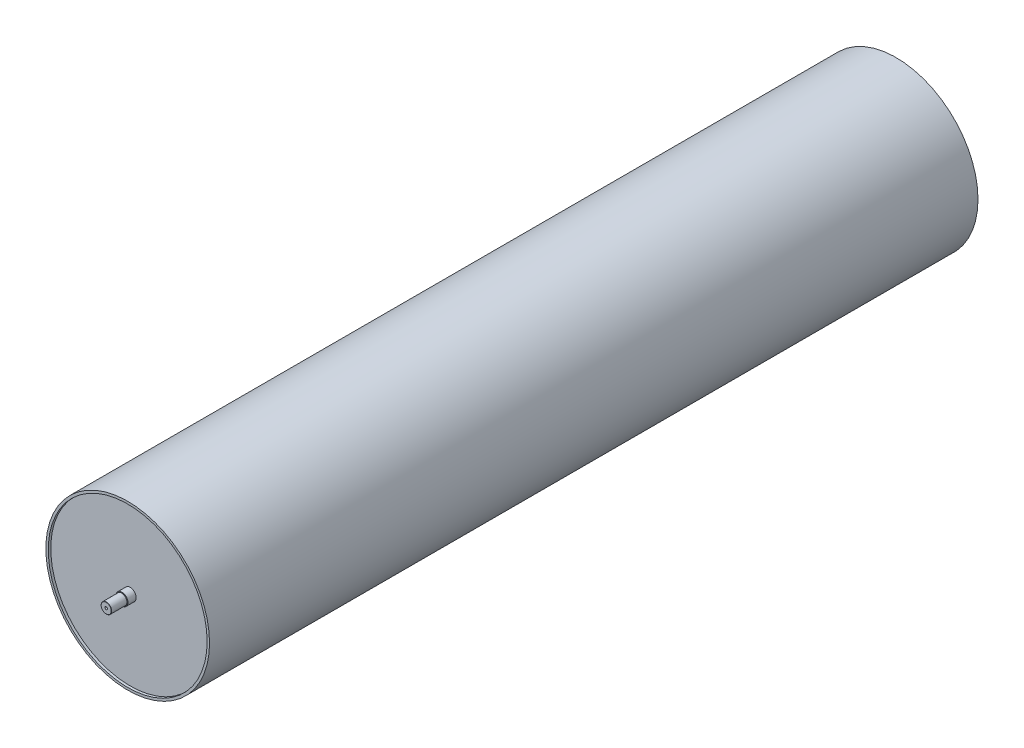
ISO-10303-21;
HEADER;
FILE_DESCRIPTION(('STEP AP214'),'2;1');
FILE_NAME('part.step','',(''),(''),'','','');
FILE_SCHEMA(('AUTOMOTIVE_DESIGN { 1 0 10303 214 1 1 1 1 }'));
ENDSEC;
DATA;
#1=APPLICATION_CONTEXT('core data for automotive mechanical design processes');
#2=APPLICATION_PROTOCOL_DEFINITION('international standard','automotive_design',2000,#1);
#3=PRODUCT_CONTEXT('',#1,'mechanical');
#4=PRODUCT('Part','Part','',(#3));
#5=PRODUCT_RELATED_PRODUCT_CATEGORY('part','',(#4));
#6=PRODUCT_DEFINITION_FORMATION('','',#4);
#7=PRODUCT_DEFINITION_CONTEXT('part definition',#1,'design');
#8=PRODUCT_DEFINITION('design','',#6,#7);
#9=PRODUCT_DEFINITION_SHAPE('','',#8);
#10=(LENGTH_UNIT() NAMED_UNIT(*) SI_UNIT(.MILLI.,.METRE.));
#11=(NAMED_UNIT(*) PLANE_ANGLE_UNIT() SI_UNIT($,.RADIAN.));
#12=(NAMED_UNIT(*) SI_UNIT($,.STERADIAN.) SOLID_ANGLE_UNIT());
#13=UNCERTAINTY_MEASURE_WITH_UNIT(LENGTH_MEASURE(1.E-05),#10,'distance_accuracy_value','');
#14=(GEOMETRIC_REPRESENTATION_CONTEXT(3) GLOBAL_UNCERTAINTY_ASSIGNED_CONTEXT((#13)) GLOBAL_UNIT_ASSIGNED_CONTEXT((#10,
#11,#12)) REPRESENTATION_CONTEXT('',''));
#15=CARTESIAN_POINT('',(0.,0.,0.));
#16=DIRECTION('',(0.,0.,1.));
#17=DIRECTION('',(1.,0.,0.));
#18=AXIS2_PLACEMENT_3D('',#15,#16,#17);
#19=CARTESIAN_POINT('',(0.,0.,767.5));
#20=DIRECTION('',(0.,0.,-1.));
#21=DIRECTION('',(-1.,0.,0.));
#22=AXIS2_PLACEMENT_3D('',#19,#20,#21);
#23=CYLINDRICAL_SURFACE('',#22,158.7);
#24=CARTESIAN_POINT('',(0.,0.,-762.5));
#25=DIRECTION('',(0.,0.,-1.));
#26=DIRECTION('',(-1.,0.,0.));
#27=AXIS2_PLACEMENT_3D('',#24,#25,#26);
#28=CIRCLE('',#27,158.7);
#29=CARTESIAN_POINT('',(-158.7,0.,-762.5));
#30=VERTEX_POINT('',#29);
#31=EDGE_CURVE('E125',#30,#30,#28,.T.);
#32=ORIENTED_EDGE('',*,*,#31,.F.);
#33=EDGE_LOOP('',(#32));
#34=FACE_BOUND('',#33,.T.);
#35=CARTESIAN_POINT('',(0.,0.,-767.5));
#36=DIRECTION('',(0.,0.,1.));
#37=DIRECTION('',(1.,0.,0.));
#38=AXIS2_PLACEMENT_3D('',#35,#36,#37);
#39=CIRCLE('',#38,158.7);
#40=CARTESIAN_POINT('',(158.7,0.,-767.5));
#41=VERTEX_POINT('',#40);
#42=EDGE_CURVE('E83',#41,#41,#39,.T.);
#43=ORIENTED_EDGE('',*,*,#42,.F.);
#44=EDGE_LOOP('',(#43));
#45=FACE_BOUND('',#44,.T.);
#46=ADVANCED_FACE('F39',(#34,#45),#23,.F.);
#47=CARTESIAN_POINT('',(0.,0.,767.5));
#48=DIRECTION('',(0.,0.,1.));
#49=DIRECTION('',(1.,0.,0.));
#50=AXIS2_PLACEMENT_3D('',#47,#48,#49);
#51=PLANE('',#50);
#52=CARTESIAN_POINT('',(0.,0.,767.5));
#53=DIRECTION('',(0.,0.,1.));
#54=DIRECTION('',(1.,0.,0.));
#55=AXIS2_PLACEMENT_3D('',#52,#53,#54);
#56=CIRCLE('',#55,163.5);
#57=CARTESIAN_POINT('',(163.5,0.,767.5));
#58=VERTEX_POINT('',#57);
#59=EDGE_CURVE('E90',#58,#58,#56,.T.);
#60=ORIENTED_EDGE('',*,*,#59,.T.);
#61=EDGE_LOOP('',(#60));
#62=FACE_BOUND('',#61,.T.);
#63=CARTESIAN_POINT('',(0.,0.,767.5));
#64=DIRECTION('',(0.,0.,1.));
#65=DIRECTION('',(1.,0.,0.));
#66=AXIS2_PLACEMENT_3D('',#63,#64,#65);
#67=CIRCLE('',#66,158.7);
#68=CARTESIAN_POINT('',(158.7,0.,767.5));
#69=VERTEX_POINT('',#68);
#70=EDGE_CURVE('E84',#69,#69,#67,.T.);
#71=ORIENTED_EDGE('',*,*,#70,.F.);
#72=EDGE_LOOP('',(#71));
#73=FACE_BOUND('',#72,.T.);
#74=ADVANCED_FACE('F161',(#62,#73),#51,.T.);
#75=CARTESIAN_POINT('',(0.,0.,-767.5));
#76=DIRECTION('',(0.,0.,1.));
#77=DIRECTION('',(1.,0.,0.));
#78=AXIS2_PLACEMENT_3D('',#75,#76,#77);
#79=PLANE('',#78);
#80=CARTESIAN_POINT('',(0.,0.,-767.5));
#81=DIRECTION('',(0.,0.,1.));
#82=DIRECTION('',(1.,0.,0.));
#83=AXIS2_PLACEMENT_3D('',#80,#81,#82);
#84=CIRCLE('',#83,163.5);
#85=CARTESIAN_POINT('',(163.5,0.,-767.5));
#86=VERTEX_POINT('',#85);
#87=EDGE_CURVE('E87',#86,#86,#84,.T.);
#88=ORIENTED_EDGE('',*,*,#87,.F.);
#89=EDGE_LOOP('',(#88));
#90=FACE_BOUND('',#89,.T.);
#91=ORIENTED_EDGE('',*,*,#42,.T.);
#92=EDGE_LOOP('',(#91));
#93=FACE_BOUND('',#92,.T.);
#94=ADVANCED_FACE('F174',(#90,#93),#79,.F.);
#95=CARTESIAN_POINT('',(0.,0.,767.5));
#96=DIRECTION('',(0.,0.,-1.));
#97=DIRECTION('',(-1.,0.,0.));
#98=AXIS2_PLACEMENT_3D('',#95,#96,#97);
#99=CYLINDRICAL_SURFACE('',#98,163.5);
#100=ORIENTED_EDGE('',*,*,#59,.F.);
#101=EDGE_LOOP('',(#100));
#102=FACE_BOUND('',#101,.T.);
#103=ORIENTED_EDGE('',*,*,#87,.T.);
#104=EDGE_LOOP('',(#103));
#105=FACE_BOUND('',#104,.T.);
#106=ADVANCED_FACE('F165',(#102,#105),#99,.T.);
#107=CARTESIAN_POINT('',(0.,0.,762.5));
#108=DIRECTION('',(0.,0.,1.));
#109=DIRECTION('',(1.,0.,0.));
#110=AXIS2_PLACEMENT_3D('',#107,#108,#109);
#111=CIRCLE('',#110,158.7);
#112=CARTESIAN_POINT('',(158.7,0.,762.5));
#113=VERTEX_POINT('',#112);
#114=EDGE_CURVE('E79',#113,#113,#111,.T.);
#115=ORIENTED_EDGE('',*,*,#114,.F.);
#116=EDGE_LOOP('',(#115));
#117=FACE_BOUND('',#116,.T.);
#118=ORIENTED_EDGE('',*,*,#70,.T.);
#119=EDGE_LOOP('',(#118));
#120=FACE_BOUND('',#119,.T.);
#121=ADVANCED_FACE('F148',(#117,#120),#23,.F.);
#122=CARTESIAN_POINT('',(0.,0.,762.5));
#123=DIRECTION('',(0.,0.,1.));
#124=DIRECTION('',(1.,0.,0.));
#125=AXIS2_PLACEMENT_3D('',#122,#123,#124);
#126=PLANE('',#125);
#127=CARTESIAN_POINT('',(0.,-3.06087000983314E-11,762.5));
#128=DIRECTION('',(0.,0.,1.));
#129=DIRECTION('',(1.,0.,0.));
#130=AXIS2_PLACEMENT_3D('',#127,#128,#129);
#131=CIRCLE('',#130,12.0000000000159);
#132=CARTESIAN_POINT('',(12.0000000000159,-3.06087000983314E-11,762.5));
#133=VERTEX_POINT('',#132);
#134=EDGE_CURVE('E74',#133,#133,#131,.F.);
#135=ORIENTED_EDGE('',*,*,#134,.T.);
#136=EDGE_LOOP('',(#135));
#137=FACE_BOUND('',#136,.T.);
#138=ORIENTED_EDGE('',*,*,#114,.T.);
#139=EDGE_LOOP('',(#138));
#140=FACE_BOUND('',#139,.T.);
#141=ADVANCED_FACE('F164',(#137,#140),#126,.T.);
#142=CARTESIAN_POINT('',(0.,-2.02962646689284E-13,810.5));
#143=DIRECTION('',(0.,0.,-1.));
#144=DIRECTION('',(0.,1.,0.));
#145=AXIS2_PLACEMENT_3D('',#142,#143,#144);
#146=PLANE('',#145);
#147=CARTESIAN_POINT('',(0.,-1.7245381709964E-11,810.5));
#148=DIRECTION('',(0.,0.,1.));
#149=DIRECTION('',(1.,0.,0.));
#150=AXIS2_PLACEMENT_3D('',#147,#148,#149);
#151=CIRCLE('',#150,2.49999999999999);
#152=CARTESIAN_POINT('',(2.49999999999999,-1.7245381709964E-11,810.5));
#153=VERTEX_POINT('',#152);
#154=EDGE_CURVE('E62',#153,#153,#151,.T.);
#155=ORIENTED_EDGE('',*,*,#154,.F.);
#156=EDGE_LOOP('',(#155));
#157=FACE_BOUND('',#156,.T.);
#158=CARTESIAN_POINT('',(0.,-3.15365293403396E-11,810.5));
#159=DIRECTION('',(0.,0.,-1.));
#160=DIRECTION('',(0.,1.,0.));
#161=AXIS2_PLACEMENT_3D('',#158,#159,#160);
#162=CIRCLE('',#161,10.0000000000314);
#163=CARTESIAN_POINT('',(0.,9.99999999999984,810.5));
#164=VERTEX_POINT('',#163);
#165=EDGE_CURVE('E104',#164,#164,#162,.F.);
#166=ORIENTED_EDGE('',*,*,#165,.T.);
#167=EDGE_LOOP('',(#166));
#168=FACE_BOUND('',#167,.T.);
#169=ADVANCED_FACE('F171',(#157,#168),#146,.F.);
#170=CARTESIAN_POINT('',(0.,-2.02962646689286E-13,-810.5));
#171=DIRECTION('',(0.,0.,1.));
#172=DIRECTION('',(0.,-1.,0.));
#173=AXIS2_PLACEMENT_3D('',#170,#171,#172);
#174=CYLINDRICAL_SURFACE('',#173,10.5000000000312);
#175=CARTESIAN_POINT('',(0.,-3.1526864452402E-11,810.));
#176=DIRECTION('',(0.,0.,-1.));
#177=DIRECTION('',(0.,1.,0.));
#178=AXIS2_PLACEMENT_3D('',#175,#176,#177);
#179=CIRCLE('',#178,10.5000000000312);
#180=CARTESIAN_POINT('',(0.,10.4999999999997,810.));
#181=VERTEX_POINT('',#180);
#182=EDGE_CURVE('E107',#181,#181,#179,.T.);
#183=ORIENTED_EDGE('',*,*,#182,.T.);
#184=EDGE_LOOP('',(#183));
#185=FACE_BOUND('',#184,.T.);
#186=CARTESIAN_POINT('',(0.,-3.09373062882093E-11,779.5));
#187=DIRECTION('',(0.,0.,1.));
#188=DIRECTION('',(0.,-1.,0.));
#189=AXIS2_PLACEMENT_3D('',#186,#187,#188);
#190=CIRCLE('',#189,10.5000000000309);
#191=CARTESIAN_POINT('',(0.,-10.5000000000619,779.499999999999));
#192=VERTEX_POINT('',#191);
#193=EDGE_CURVE('E61',#192,#192,#190,.T.);
#194=ORIENTED_EDGE('',*,*,#193,.T.);
#195=EDGE_LOOP('',(#194));
#196=FACE_BOUND('',#195,.T.);
#197=ADVANCED_FACE('F247',(#185,#196),#174,.T.);
#198=CARTESIAN_POINT('',(0.,10.5,779.5));
#199=DIRECTION('',(0.,0.,-1.));
#200=DIRECTION('',(0.,1.,0.));
#201=AXIS2_PLACEMENT_3D('',#198,#199,#200);
#202=PLANE('',#201);
#203=CARTESIAN_POINT('',(0.,-3.09373062882093E-11,779.5));
#204=DIRECTION('',(0.,0.,-1.));
#205=DIRECTION('',(0.,1.,0.));
#206=AXIS2_PLACEMENT_3D('',#203,#204,#205);
#207=CIRCLE('',#206,11.5000000000308);
#208=CARTESIAN_POINT('',(0.,11.4999999999998,779.5));
#209=VERTEX_POINT('',#208);
#210=EDGE_CURVE('E110',#209,#209,#207,.F.);
#211=ORIENTED_EDGE('',*,*,#210,.T.);
#212=EDGE_LOOP('',(#211));
#213=FACE_BOUND('',#212,.T.);
#214=ORIENTED_EDGE('',*,*,#193,.F.);
#215=EDGE_LOOP('',(#214));
#216=FACE_BOUND('',#215,.T.);
#217=ADVANCED_FACE('F244',(#213,#216),#202,.F.);
#218=CARTESIAN_POINT('',(0.,-2.02962646689286E-13,-810.5));
#219=DIRECTION('',(0.,0.,1.));
#220=DIRECTION('',(0.,-1.,0.));
#221=AXIS2_PLACEMENT_3D('',#218,#219,#220);
#222=CYLINDRICAL_SURFACE('',#221,12.0000000000159);
#223=CARTESIAN_POINT('',(0.,-3.0927641400272E-11,779.000000000015));
#224=DIRECTION('',(0.,0.,-1.));
#225=DIRECTION('',(0.,1.,0.));
#226=AXIS2_PLACEMENT_3D('',#223,#224,#225);
#227=CIRCLE('',#226,12.0000000000159);
#228=CARTESIAN_POINT('',(0.,11.9999999999849,779.000000000015));
#229=VERTEX_POINT('',#228);
#230=EDGE_CURVE('E113',#229,#229,#227,.T.);
#231=ORIENTED_EDGE('',*,*,#230,.T.);
#232=EDGE_LOOP('',(#231));
#233=FACE_BOUND('',#232,.T.);
#234=ORIENTED_EDGE('',*,*,#134,.F.);
#235=EDGE_LOOP('',(#234));
#236=FACE_BOUND('',#235,.T.);
#237=ADVANCED_FACE('F205',(#233,#236),#222,.T.);
#238=CARTESIAN_POINT('',(0.,-3.15365293403396E-11,810.5));
#239=DIRECTION('',(0.,0.,-1.));
#240=DIRECTION('',(0.,1.,0.));
#241=AXIS2_PLACEMENT_3D('',#238,#239,#240);
#242=CONICAL_SURFACE('',#241,10.0000000000313,0.785398163397693);
#243=ORIENTED_EDGE('',*,*,#182,.F.);
#244=EDGE_LOOP('',(#243));
#245=FACE_BOUND('',#244,.T.);
#246=ORIENTED_EDGE('',*,*,#165,.F.);
#247=EDGE_LOOP('',(#246));
#248=FACE_BOUND('',#247,.T.);
#249=ADVANCED_FACE('F199',(#245,#248),#242,.T.);
#250=CARTESIAN_POINT('',(0.,-3.09373062882093E-11,779.5));
#251=DIRECTION('',(0.,0.,-1.));
#252=DIRECTION('',(0.,1.,0.));
#253=AXIS2_PLACEMENT_3D('',#250,#251,#252);
#254=CONICAL_SURFACE('',#253,11.5000000000308,0.78539816339746);
#255=ORIENTED_EDGE('',*,*,#230,.F.);
#256=EDGE_LOOP('',(#255));
#257=FACE_BOUND('',#256,.T.);
#258=ORIENTED_EDGE('',*,*,#210,.F.);
#259=EDGE_LOOP('',(#258));
#260=FACE_BOUND('',#259,.T.);
#261=ADVANCED_FACE('F55',(#257,#260),#254,.T.);
#262=CARTESIAN_POINT('',(0.,-1.7245381709964E-11,795.5));
#263=DIRECTION('',(0.,0.,1.));
#264=DIRECTION('',(1.,0.,0.));
#265=AXIS2_PLACEMENT_3D('',#262,#263,#264);
#266=CONICAL_SURFACE('',#265,2.49999999999999,1.02974425867667);
#267=CARTESIAN_POINT('',(0.,-1.7245381709964E-11,793.997848452431));
#268=VERTEX_POINT('',#267);
#269=VERTEX_LOOP('',#268);
#270=FACE_BOUND('',#269,.T.);
#271=CARTESIAN_POINT('',(0.,-1.7245381709964E-11,795.5));
#272=DIRECTION('',(0.,0.,1.));
#273=DIRECTION('',(1.,0.,0.));
#274=AXIS2_PLACEMENT_3D('',#271,#272,#273);
#275=CIRCLE('',#274,2.49999999999999);
#276=CARTESIAN_POINT('',(2.49999999999999,-1.7245381709964E-11,795.5));
#277=VERTEX_POINT('',#276);
#278=EDGE_CURVE('E59',#277,#277,#275,.T.);
#279=ORIENTED_EDGE('',*,*,#278,.T.);
#280=EDGE_LOOP('',(#279));
#281=FACE_BOUND('',#280,.T.);
#282=ADVANCED_FACE('F51',(#270,#281),#266,.F.);
#283=CARTESIAN_POINT('',(0.,-1.7245381709964E-11,810.5));
#284=DIRECTION('',(0.,0.,1.));
#285=DIRECTION('',(1.,0.,0.));
#286=AXIS2_PLACEMENT_3D('',#283,#284,#285);
#287=CYLINDRICAL_SURFACE('',#286,2.49999999999999);
#288=ORIENTED_EDGE('',*,*,#278,.F.);
#289=EDGE_LOOP('',(#288));
#290=FACE_BOUND('',#289,.T.);
#291=ORIENTED_EDGE('',*,*,#154,.T.);
#292=EDGE_LOOP('',(#291));
#293=FACE_BOUND('',#292,.T.);
#294=ADVANCED_FACE('F54',(#290,#293),#287,.F.);
#295=CARTESIAN_POINT('',(0.,0.,-762.5));
#296=DIRECTION('',(0.,0.,-1.));
#297=DIRECTION('',(1.,0.,0.));
#298=AXIS2_PLACEMENT_3D('',#295,#296,#297);
#299=PLANE('',#298);
#300=CARTESIAN_POINT('',(0.,-1.13079188869744E-12,-762.5));
#301=DIRECTION('',(0.,0.,-1.));
#302=DIRECTION('',(-1.,0.,0.));
#303=AXIS2_PLACEMENT_3D('',#300,#301,#302);
#304=CIRCLE('',#303,12.0000000000159);
#305=CARTESIAN_POINT('',(-12.0000000000159,-1.13079188869744E-12,-762.5));
#306=VERTEX_POINT('',#305);
#307=EDGE_CURVE('E68',#306,#306,#304,.T.);
#308=ORIENTED_EDGE('',*,*,#307,.F.);
#309=EDGE_LOOP('',(#308));
#310=FACE_BOUND('',#309,.T.);
#311=ORIENTED_EDGE('',*,*,#31,.T.);
#312=EDGE_LOOP('',(#311));
#313=FACE_BOUND('',#312,.T.);
#314=ADVANCED_FACE('F265',(#310,#313),#299,.T.);
#315=CARTESIAN_POINT('',(0.,10.5,-810.5));
#316=DIRECTION('',(0.,0.,1.));
#317=DIRECTION('',(0.,-1.,0.));
#318=AXIS2_PLACEMENT_3D('',#315,#316,#317);
#319=PLANE('',#318);
#320=CARTESIAN_POINT('',(0.,-2.09056045117504E-13,-810.5));
#321=DIRECTION('',(0.,0.,-1.));
#322=DIRECTION('',(0.,1.,0.));
#323=AXIS2_PLACEMENT_3D('',#320,#321,#322);
#324=CIRCLE('',#323,7.00000000000412);
#325=CARTESIAN_POINT('',(0.,7.00000000000391,-810.5));
#326=VERTEX_POINT('',#325);
#327=EDGE_CURVE('E130',#326,#326,#324,.T.);
#328=ORIENTED_EDGE('',*,*,#327,.F.);
#329=EDGE_LOOP('',(#328));
#330=FACE_BOUND('',#329,.T.);
#331=CARTESIAN_POINT('',(0.,-2.02962646689284E-13,-810.5));
#332=DIRECTION('',(0.,0.,1.));
#333=DIRECTION('',(0.,-1.,0.));
#334=AXIS2_PLACEMENT_3D('',#331,#332,#333);
#335=CIRCLE('',#334,10.0000000000004);
#336=CARTESIAN_POINT('',(0.,-10.0000000000006,-810.5));
#337=VERTEX_POINT('',#336);
#338=EDGE_CURVE('E101',#337,#337,#335,.F.);
#339=ORIENTED_EDGE('',*,*,#338,.T.);
#340=EDGE_LOOP('',(#339));
#341=FACE_BOUND('',#340,.T.);
#342=ADVANCED_FACE('F197',(#330,#341),#319,.F.);
#343=CARTESIAN_POINT('',(0.,-2.12627534626871E-13,-810.));
#344=DIRECTION('',(0.,0.,1.));
#345=DIRECTION('',(0.,-1.,0.));
#346=AXIS2_PLACEMENT_3D('',#343,#344,#345);
#347=CONICAL_SURFACE('',#346,10.5000000000005,0.785398163397469);
#348=ORIENTED_EDGE('',*,*,#338,.F.);
#349=EDGE_LOOP('',(#348));
#350=FACE_BOUND('',#349,.T.);
#351=CARTESIAN_POINT('',(0.,-2.1262753462687E-13,-810.));
#352=DIRECTION('',(0.,0.,1.));
#353=DIRECTION('',(0.,-1.,0.));
#354=AXIS2_PLACEMENT_3D('',#351,#352,#353);
#355=CIRCLE('',#354,10.5000000000005);
#356=CARTESIAN_POINT('',(0.,-10.5000000000007,-810.));
#357=VERTEX_POINT('',#356);
#358=EDGE_CURVE('E78',#357,#357,#355,.T.);
#359=ORIENTED_EDGE('',*,*,#358,.F.);
#360=EDGE_LOOP('',(#359));
#361=FACE_BOUND('',#360,.T.);
#362=ADVANCED_FACE('F190',(#350,#361),#347,.T.);
#363=CARTESIAN_POINT('',(0.,-2.02962646689286E-13,-810.5));
#364=DIRECTION('',(0.,0.,1.));
#365=DIRECTION('',(0.,-1.,0.));
#366=AXIS2_PLACEMENT_3D('',#363,#364,#365);
#367=CYLINDRICAL_SURFACE('',#366,10.5000000000005);
#368=ORIENTED_EDGE('',*,*,#358,.T.);
#369=EDGE_LOOP('',(#368));
#370=FACE_BOUND('',#369,.T.);
#371=CARTESIAN_POINT('',(0.,-8.02185698819547E-13,-779.5));
#372=DIRECTION('',(0.,0.,1.));
#373=DIRECTION('',(0.,-1.,0.));
#374=AXIS2_PLACEMENT_3D('',#371,#372,#373);
#375=CIRCLE('',#374,10.5000000000008);
#376=CARTESIAN_POINT('',(0.,-10.5000000000016,-779.5));
#377=VERTEX_POINT('',#376);
#378=EDGE_CURVE('E65',#377,#377,#375,.T.);
#379=ORIENTED_EDGE('',*,*,#378,.F.);
#380=EDGE_LOOP('',(#379));
#381=FACE_BOUND('',#380,.T.);
#382=ADVANCED_FACE('F196',(#370,#381),#367,.T.);
#383=CARTESIAN_POINT('',(0.,12.,-779.5));
#384=DIRECTION('',(0.,0.,1.));
#385=DIRECTION('',(0.,-1.,0.));
#386=AXIS2_PLACEMENT_3D('',#383,#384,#385);
#387=PLANE('',#386);
#388=CARTESIAN_POINT('',(0.,-8.02185698819545E-13,-779.5));
#389=DIRECTION('',(0.,0.,1.));
#390=DIRECTION('',(0.,-1.,0.));
#391=AXIS2_PLACEMENT_3D('',#388,#389,#390);
#392=CIRCLE('',#391,11.500000000001);
#393=CARTESIAN_POINT('',(0.,-11.5000000000018,-779.500000000001));
#394=VERTEX_POINT('',#393);
#395=EDGE_CURVE('E119',#394,#394,#392,.F.);
#396=ORIENTED_EDGE('',*,*,#395,.T.);
#397=EDGE_LOOP('',(#396));
#398=FACE_BOUND('',#397,.T.);
#399=ORIENTED_EDGE('',*,*,#378,.T.);
#400=EDGE_LOOP('',(#399));
#401=FACE_BOUND('',#400,.T.);
#402=ADVANCED_FACE('F217',(#398,#401),#387,.F.);
#403=CARTESIAN_POINT('',(0.,-8.11850586757414E-13,-778.999999999986));
#404=DIRECTION('',(0.,0.,1.));
#405=DIRECTION('',(0.,-1.,0.));
#406=AXIS2_PLACEMENT_3D('',#403,#404,#405);
#407=CONICAL_SURFACE('',#406,12.0000000000159,0.785398163397568);
#408=ORIENTED_EDGE('',*,*,#395,.F.);
#409=EDGE_LOOP('',(#408));
#410=FACE_BOUND('',#409,.T.);
#411=CARTESIAN_POINT('',(0.,-8.11850586757414E-13,-778.999999999986));
#412=DIRECTION('',(0.,0.,1.));
#413=DIRECTION('',(0.,-1.,0.));
#414=AXIS2_PLACEMENT_3D('',#411,#412,#413);
#415=CIRCLE('',#414,12.0000000000159);
#416=CARTESIAN_POINT('',(0.,-12.0000000000167,-778.999999999986));
#417=VERTEX_POINT('',#416);
#418=EDGE_CURVE('E116',#417,#417,#415,.T.);
#419=ORIENTED_EDGE('',*,*,#418,.F.);
#420=EDGE_LOOP('',(#419));
#421=FACE_BOUND('',#420,.T.);
#422=ADVANCED_FACE('F212',(#410,#421),#407,.T.);
#423=ORIENTED_EDGE('',*,*,#307,.T.);
#424=EDGE_LOOP('',(#423));
#425=FACE_BOUND('',#424,.T.);
#426=ORIENTED_EDGE('',*,*,#418,.T.);
#427=EDGE_LOOP('',(#426));
#428=FACE_BOUND('',#427,.T.);
#429=ADVANCED_FACE('F216',(#425,#428),#222,.T.);
#430=CARTESIAN_POINT('',(0.,0.,-840.5));
#431=DIRECTION('',(0.,0.,1.));
#432=DIRECTION('',(0.,-1.,0.));
#433=AXIS2_PLACEMENT_3D('',#430,#431,#432);
#434=CYLINDRICAL_SURFACE('',#433,7.00000000000412);
#435=CARTESIAN_POINT('',(0.,0.,-840.));
#436=DIRECTION('',(0.,0.,-1.));
#437=DIRECTION('',(0.,1.,0.));
#438=AXIS2_PLACEMENT_3D('',#435,#436,#437);
#439=CIRCLE('',#438,7.00000000000412);
#440=CARTESIAN_POINT('',(0.,7.00000000000412,-840.));
#441=VERTEX_POINT('',#440);
#442=EDGE_CURVE('E11',#441,#441,#439,.F.);
#443=ORIENTED_EDGE('',*,*,#442,.T.);
#444=EDGE_LOOP('',(#443));
#445=FACE_BOUND('',#444,.T.);
#446=ORIENTED_EDGE('',*,*,#327,.T.);
#447=EDGE_LOOP('',(#446));
#448=FACE_BOUND('',#447,.T.);
#449=ADVANCED_FACE('F223',(#445,#448),#434,.T.);
#450=CARTESIAN_POINT('',(0.,0.,-840.5));
#451=DIRECTION('',(0.,0.,-1.));
#452=DIRECTION('',(0.,1.,0.));
#453=AXIS2_PLACEMENT_3D('',#450,#451,#452);
#454=PLANE('',#453);
#455=CARTESIAN_POINT('',(0.,0.,-840.5));
#456=DIRECTION('',(0.,0.,-1.));
#457=DIRECTION('',(0.,1.,0.));
#458=AXIS2_PLACEMENT_3D('',#455,#456,#457);
#459=CIRCLE('',#458,6.5000000000039);
#460=CARTESIAN_POINT('',(0.,6.50000000000391,-840.5));
#461=VERTEX_POINT('',#460);
#462=EDGE_CURVE('E48',#461,#461,#459,.T.);
#463=ORIENTED_EDGE('',*,*,#462,.T.);
#464=EDGE_LOOP('',(#463));
#465=FACE_BOUND('',#464,.T.);
#466=ADVANCED_FACE('F272',(#465),#454,.T.);
#467=CARTESIAN_POINT('',(0.,0.,-840.5));
#468=DIRECTION('',(0.,0.,1.));
#469=DIRECTION('',(0.,-1.,0.));
#470=AXIS2_PLACEMENT_3D('',#467,#468,#469);
#471=CONICAL_SURFACE('',#470,6.5000000000039,0.785398163397385);
#472=ORIENTED_EDGE('',*,*,#442,.F.);
#473=EDGE_LOOP('',(#472));
#474=FACE_BOUND('',#473,.T.);
#475=ORIENTED_EDGE('',*,*,#462,.F.);
#476=EDGE_LOOP('',(#475));
#477=FACE_BOUND('',#476,.T.);
#478=ADVANCED_FACE('F42',(#474,#477),#471,.T.);
#479=CLOSED_SHELL('',(#46,#74,#94,#106,#121,#141,#169,#197,#217,#237,#249,#261,#282,#294,#314,
#342,#362,#382,#402,#422,#429,#449,#466,#478));
#480=CARTESIAN_POINT('',(0.,0.,-757.5));
#481=DIRECTION('',(0.,0.,-1.));
#482=DIRECTION('',(1.,0.,0.));
#483=AXIS2_PLACEMENT_3D('',#480,#481,#482);
#484=PLANE('',#483);
#485=CARTESIAN_POINT('',(0.,-1.22744076807329E-12,-757.5));
#486=DIRECTION('',(0.,0.,-1.));
#487=DIRECTION('',(-1.,0.,0.));
#488=AXIS2_PLACEMENT_3D('',#485,#486,#487);
#489=CIRCLE('',#488,12.0000000000159);
#490=CARTESIAN_POINT('',(-12.0000000000159,-1.22744076807329E-12,-757.5));
#491=VERTEX_POINT('',#490);
#492=EDGE_CURVE('E122',#491,#491,#489,.T.);
#493=ORIENTED_EDGE('',*,*,#492,.T.);
#494=EDGE_LOOP('',(#493));
#495=FACE_BOUND('',#494,.T.);
#496=CARTESIAN_POINT('',(0.,0.,-757.5));
#497=DIRECTION('',(0.,0.,1.));
#498=DIRECTION('',(1.,0.,0.));
#499=AXIS2_PLACEMENT_3D('',#496,#497,#498);
#500=CIRCLE('',#499,158.7);
#501=CARTESIAN_POINT('',(158.7,0.,-757.5));
#502=VERTEX_POINT('',#501);
#503=EDGE_CURVE('E128',#502,#502,#500,.T.);
#504=ORIENTED_EDGE('',*,*,#503,.T.);
#505=EDGE_LOOP('',(#504));
#506=FACE_BOUND('',#505,.T.);
#507=ADVANCED_FACE('F141',(#495,#506),#484,.F.);
#508=CARTESIAN_POINT('',(0.,0.,757.5));
#509=DIRECTION('',(0.,0.,1.));
#510=DIRECTION('',(1.,0.,0.));
#511=AXIS2_PLACEMENT_3D('',#508,#509,#510);
#512=CIRCLE('',#511,158.7);
#513=CARTESIAN_POINT('',(158.7,0.,757.5));
#514=VERTEX_POINT('',#513);
#515=EDGE_CURVE('E80',#514,#514,#512,.T.);
#516=ORIENTED_EDGE('',*,*,#515,.T.);
#517=EDGE_LOOP('',(#516));
#518=FACE_BOUND('',#517,.T.);
#519=ORIENTED_EDGE('',*,*,#503,.F.);
#520=EDGE_LOOP('',(#519));
#521=FACE_BOUND('',#520,.T.);
#522=ADVANCED_FACE('F143',(#518,#521),#23,.F.);
#523=CARTESIAN_POINT('',(0.,0.,757.5));
#524=DIRECTION('',(0.,0.,1.));
#525=DIRECTION('',(1.,0.,0.));
#526=AXIS2_PLACEMENT_3D('',#523,#524,#525);
#527=PLANE('',#526);
#528=CARTESIAN_POINT('',(0.,-3.05120512189556E-11,757.5));
#529=DIRECTION('',(0.,0.,1.));
#530=DIRECTION('',(1.,0.,0.));
#531=AXIS2_PLACEMENT_3D('',#528,#529,#530);
#532=CIRCLE('',#531,12.0000000000159);
#533=CARTESIAN_POINT('',(12.0000000000159,-3.05120512189556E-11,757.5));
#534=VERTEX_POINT('',#533);
#535=EDGE_CURVE('E75',#534,#534,#532,.F.);
#536=ORIENTED_EDGE('',*,*,#535,.F.);
#537=EDGE_LOOP('',(#536));
#538=FACE_BOUND('',#537,.T.);
#539=ORIENTED_EDGE('',*,*,#515,.F.);
#540=EDGE_LOOP('',(#539));
#541=FACE_BOUND('',#540,.T.);
#542=ADVANCED_FACE('F145',(#538,#541),#527,.F.);
#543=ORIENTED_EDGE('',*,*,#535,.T.);
#544=EDGE_LOOP('',(#543));
#545=FACE_BOUND('',#544,.T.);
#546=ORIENTED_EDGE('',*,*,#492,.F.);
#547=EDGE_LOOP('',(#546));
#548=FACE_BOUND('',#547,.T.);
#549=ADVANCED_FACE('F154',(#545,#548),#222,.T.);
#550=CLOSED_SHELL('',(#507,#522,#542,#549));
#551=ORIENTED_CLOSED_SHELL('',*,#550,.T.);
#552=BREP_WITH_VOIDS('B2',#479,(#551));
#553=ADVANCED_BREP_SHAPE_REPRESENTATION('',(#18,#552),#14);
#554=SHAPE_DEFINITION_REPRESENTATION(#9,#553);
ENDSEC;
END-ISO-10303-21;
